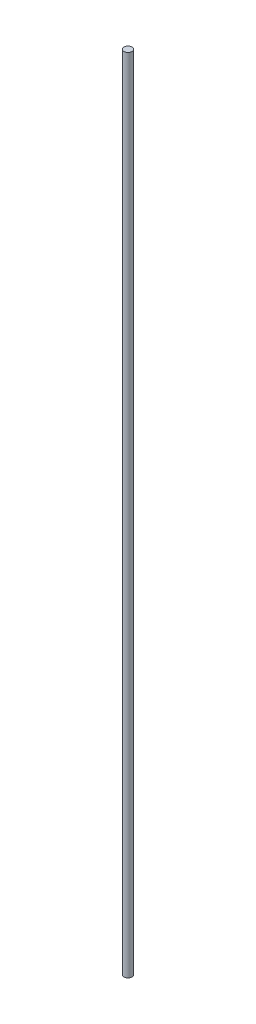
ISO-10303-21;
HEADER;
FILE_DESCRIPTION(('STEP AP214'),'2;1');
FILE_NAME('part.step','',(''),(''),'','','');
FILE_SCHEMA(('AUTOMOTIVE_DESIGN { 1 0 10303 214 1 1 1 1 }'));
ENDSEC;
DATA;
#1=APPLICATION_CONTEXT('core data for automotive mechanical design processes');
#2=APPLICATION_PROTOCOL_DEFINITION('international standard','automotive_design',2000,#1);
#3=PRODUCT_CONTEXT('',#1,'mechanical');
#4=PRODUCT('Part','Part','',(#3));
#5=PRODUCT_RELATED_PRODUCT_CATEGORY('part','',(#4));
#6=PRODUCT_DEFINITION_FORMATION('','',#4);
#7=PRODUCT_DEFINITION_CONTEXT('part definition',#1,'design');
#8=PRODUCT_DEFINITION('design','',#6,#7);
#9=PRODUCT_DEFINITION_SHAPE('','',#8);
#10=(LENGTH_UNIT() NAMED_UNIT(*) SI_UNIT(.MILLI.,.METRE.));
#11=(NAMED_UNIT(*) PLANE_ANGLE_UNIT() SI_UNIT($,.RADIAN.));
#12=(NAMED_UNIT(*) SI_UNIT($,.STERADIAN.) SOLID_ANGLE_UNIT());
#13=UNCERTAINTY_MEASURE_WITH_UNIT(LENGTH_MEASURE(1.E-05),#10,'distance_accuracy_value','');
#14=(GEOMETRIC_REPRESENTATION_CONTEXT(3) GLOBAL_UNCERTAINTY_ASSIGNED_CONTEXT((#13)) GLOBAL_UNIT_ASSIGNED_CONTEXT((#10,
#11,#12)) REPRESENTATION_CONTEXT('',''));
#15=CARTESIAN_POINT('',(0.,0.,0.));
#16=DIRECTION('',(0.,0.,1.));
#17=DIRECTION('',(1.,0.,0.));
#18=AXIS2_PLACEMENT_3D('',#15,#16,#17);
#19=CARTESIAN_POINT('',(0.,-400.,0.));
#20=DIRECTION('',(0.,1.,0.));
#21=DIRECTION('',(0.,0.,1.));
#22=AXIS2_PLACEMENT_3D('',#19,#20,#21);
#23=CYLINDRICAL_SURFACE('',#22,4.);
#24=CARTESIAN_POINT('',(0.,-400.,0.));
#25=DIRECTION('',(0.,1.,0.));
#26=DIRECTION('',(0.,0.,1.));
#27=AXIS2_PLACEMENT_3D('',#24,#25,#26);
#28=CIRCLE('',#27,4.);
#29=CARTESIAN_POINT('',(0.,-400.,4.));
#30=VERTEX_POINT('',#29);
#31=EDGE_CURVE('E10',#30,#30,#28,.T.);
#32=ORIENTED_EDGE('',*,*,#31,.T.);
#33=EDGE_LOOP('',(#32));
#34=FACE_BOUND('',#33,.T.);
#35=CARTESIAN_POINT('',(0.,410.,0.));
#36=DIRECTION('',(0.,1.,0.));
#37=DIRECTION('',(0.,0.,1.));
#38=AXIS2_PLACEMENT_3D('',#35,#36,#37);
#39=CIRCLE('',#38,4.);
#40=CARTESIAN_POINT('',(0.,410.,4.));
#41=VERTEX_POINT('',#40);
#42=EDGE_CURVE('E42',#41,#41,#39,.T.);
#43=ORIENTED_EDGE('',*,*,#42,.F.);
#44=EDGE_LOOP('',(#43));
#45=FACE_BOUND('',#44,.T.);
#46=ADVANCED_FACE('F36',(#34,#45),#23,.T.);
#47=CARTESIAN_POINT('',(0.,-400.,0.));
#48=DIRECTION('',(0.,1.,0.));
#49=DIRECTION('',(0.,0.,1.));
#50=AXIS2_PLACEMENT_3D('',#47,#48,#49);
#51=PLANE('',#50);
#52=ORIENTED_EDGE('',*,*,#31,.F.);
#53=EDGE_LOOP('',(#52));
#54=FACE_BOUND('',#53,.T.);
#55=ADVANCED_FACE('F51',(#54),#51,.F.);
#56=CARTESIAN_POINT('',(0.,410.,0.));
#57=DIRECTION('',(0.,1.,0.));
#58=DIRECTION('',(0.,0.,1.));
#59=AXIS2_PLACEMENT_3D('',#56,#57,#58);
#60=PLANE('',#59);
#61=ORIENTED_EDGE('',*,*,#42,.T.);
#62=EDGE_LOOP('',(#61));
#63=FACE_BOUND('',#62,.T.);
#64=ADVANCED_FACE('F48',(#63),#60,.T.);
#65=CLOSED_SHELL('',(#46,#55,#64));
#66=MANIFOLD_SOLID_BREP('B2',#65);
#67=ADVANCED_BREP_SHAPE_REPRESENTATION('',(#18,#66),#14);
#68=SHAPE_DEFINITION_REPRESENTATION(#9,#67);
ENDSEC;
END-ISO-10303-21;
